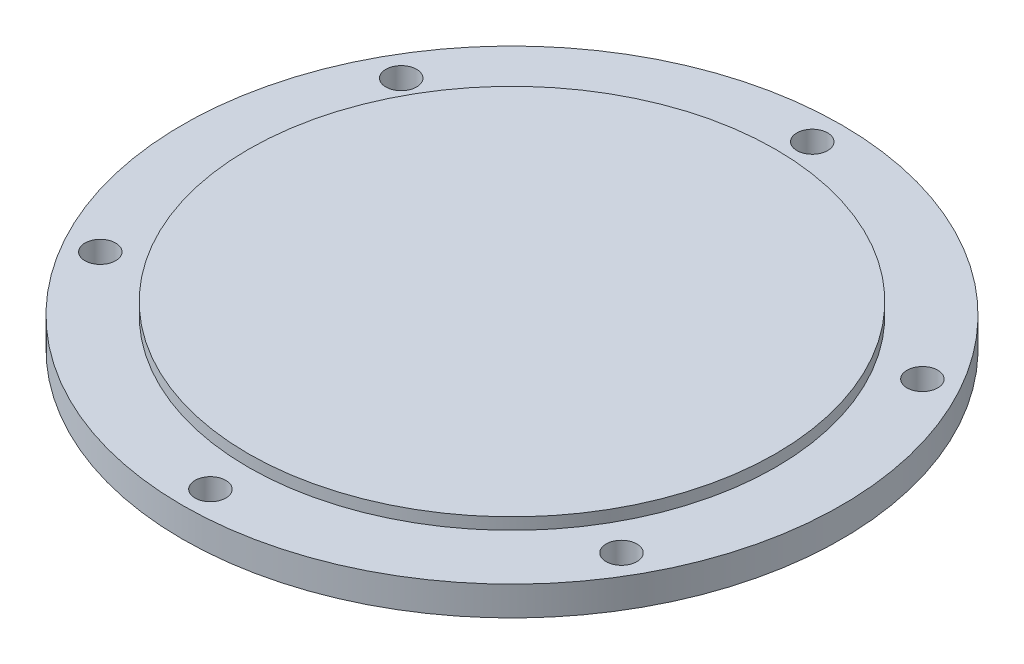
ISO-10303-21;
HEADER;
FILE_DESCRIPTION(('STEP AP214'),'2;1');
FILE_NAME('part.step','',(''),(''),'','','');
FILE_SCHEMA(('AUTOMOTIVE_DESIGN { 1 0 10303 214 1 1 1 1 }'));
ENDSEC;
DATA;
#1=APPLICATION_CONTEXT('core data for automotive mechanical design processes');
#2=APPLICATION_PROTOCOL_DEFINITION('international standard','automotive_design',2000,#1);
#3=PRODUCT_CONTEXT('',#1,'mechanical');
#4=PRODUCT('Part','Part','',(#3));
#5=PRODUCT_RELATED_PRODUCT_CATEGORY('part','',(#4));
#6=PRODUCT_DEFINITION_FORMATION('','',#4);
#7=PRODUCT_DEFINITION_CONTEXT('part definition',#1,'design');
#8=PRODUCT_DEFINITION('design','',#6,#7);
#9=PRODUCT_DEFINITION_SHAPE('','',#8);
#10=(LENGTH_UNIT() NAMED_UNIT(*) SI_UNIT(.MILLI.,.METRE.));
#11=(NAMED_UNIT(*) PLANE_ANGLE_UNIT() SI_UNIT($,.RADIAN.));
#12=(NAMED_UNIT(*) SI_UNIT($,.STERADIAN.) SOLID_ANGLE_UNIT());
#13=UNCERTAINTY_MEASURE_WITH_UNIT(LENGTH_MEASURE(1.E-05),#10,'distance_accuracy_value','');
#14=(GEOMETRIC_REPRESENTATION_CONTEXT(3) GLOBAL_UNCERTAINTY_ASSIGNED_CONTEXT((#13)) GLOBAL_UNIT_ASSIGNED_CONTEXT((#10,
#11,#12)) REPRESENTATION_CONTEXT('',''));
#15=CARTESIAN_POINT('',(0.,0.,0.));
#16=DIRECTION('',(0.,0.,1.));
#17=DIRECTION('',(1.,0.,0.));
#18=AXIS2_PLACEMENT_3D('',#15,#16,#17);
#19=CARTESIAN_POINT('',(0.,10.,0.));
#20=DIRECTION('',(0.,-1.,0.));
#21=DIRECTION('',(0.,0.,-1.));
#22=AXIS2_PLACEMENT_3D('',#19,#20,#21);
#23=CYLINDRICAL_SURFACE('',#22,112.5);
#24=CARTESIAN_POINT('',(0.,10.,0.));
#25=DIRECTION('',(0.,1.,0.));
#26=DIRECTION('',(0.,0.,1.));
#27=AXIS2_PLACEMENT_3D('',#24,#25,#26);
#28=CIRCLE('',#27,112.5);
#29=CARTESIAN_POINT('',(0.,10.,112.5));
#30=VERTEX_POINT('',#29);
#31=EDGE_CURVE('E10',#30,#30,#28,.T.);
#32=ORIENTED_EDGE('',*,*,#31,.F.);
#33=EDGE_LOOP('',(#32));
#34=FACE_BOUND('',#33,.T.);
#35=CARTESIAN_POINT('',(0.,0.,0.));
#36=DIRECTION('',(0.,1.,0.));
#37=DIRECTION('',(0.,0.,1.));
#38=AXIS2_PLACEMENT_3D('',#35,#36,#37);
#39=CIRCLE('',#38,112.5);
#40=CARTESIAN_POINT('',(0.,0.,112.5));
#41=VERTEX_POINT('',#40);
#42=EDGE_CURVE('E33',#41,#41,#39,.T.);
#43=ORIENTED_EDGE('',*,*,#42,.T.);
#44=EDGE_LOOP('',(#43));
#45=FACE_BOUND('',#44,.T.);
#46=ADVANCED_FACE('F30',(#34,#45),#23,.T.);
#47=CARTESIAN_POINT('',(0.,10.,0.));
#48=DIRECTION('',(0.,1.,0.));
#49=DIRECTION('',(0.,0.,1.));
#50=AXIS2_PLACEMENT_3D('',#47,#48,#49);
#51=PLANE('',#50);
#52=CARTESIAN_POINT('',(0.,10.,0.));
#53=DIRECTION('',(0.,1.,0.));
#54=DIRECTION('',(0.,0.,1.));
#55=AXIS2_PLACEMENT_3D('',#52,#53,#54);
#56=CIRCLE('',#55,90.);
#57=CARTESIAN_POINT('',(0.,10.,90.));
#58=VERTEX_POINT('',#57);
#59=EDGE_CURVE('E78',#58,#58,#56,.T.);
#60=ORIENTED_EDGE('',*,*,#59,.F.);
#61=EDGE_LOOP('',(#60));
#62=FACE_BOUND('',#61,.T.);
#63=CARTESIAN_POINT('',(88.9613419214222,10.,-51.1381452941973));
#64=DIRECTION('',(0.,1.,0.));
#65=DIRECTION('',(0.,0.,1.));
#66=AXIS2_PLACEMENT_3D('',#63,#64,#65);
#67=CIRCLE('',#66,5.24999999999999);
#68=CARTESIAN_POINT('',(88.9613419214222,10.,-45.8881452941973));
#69=VERTEX_POINT('',#68);
#70=EDGE_CURVE('E74',#69,#69,#67,.T.);
#71=ORIENTED_EDGE('',*,*,#70,.F.);
#72=EDGE_LOOP('',(#71));
#73=FACE_BOUND('',#72,.T.);
#74=CARTESIAN_POINT('',(88.9613419214232,10.,51.5855641174105));
#75=DIRECTION('',(0.,1.,0.));
#76=DIRECTION('',(0.,0.,1.));
#77=AXIS2_PLACEMENT_3D('',#74,#75,#76);
#78=CIRCLE('',#77,5.24999999999999);
#79=CARTESIAN_POINT('',(88.9613419214232,10.,56.8355641174105));
#80=VERTEX_POINT('',#79);
#81=EDGE_CURVE('E68',#80,#80,#78,.T.);
#82=ORIENTED_EDGE('',*,*,#81,.F.);
#83=EDGE_LOOP('',(#82));
#84=FACE_BOUND('',#83,.T.);
#85=CARTESIAN_POINT('',(0.,10.,102.947418823215));
#86=DIRECTION('',(0.,1.,0.));
#87=DIRECTION('',(0.,0.,1.));
#88=AXIS2_PLACEMENT_3D('',#85,#86,#87);
#89=CIRCLE('',#88,5.25);
#90=CARTESIAN_POINT('',(0.,10.,108.197418823215));
#91=VERTEX_POINT('',#90);
#92=EDGE_CURVE('E62',#91,#91,#89,.T.);
#93=ORIENTED_EDGE('',*,*,#92,.F.);
#94=EDGE_LOOP('',(#93));
#95=FACE_BOUND('',#94,.T.);
#96=CARTESIAN_POINT('',(-88.9613419214225,10.,51.5855641174117));
#97=DIRECTION('',(0.,1.,0.));
#98=DIRECTION('',(0.,0.,1.));
#99=AXIS2_PLACEMENT_3D('',#96,#97,#98);
#100=CIRCLE('',#99,5.24999999999999);
#101=CARTESIAN_POINT('',(-88.9613419214225,10.,56.8355641174117));
#102=VERTEX_POINT('',#101);
#103=EDGE_CURVE('E56',#102,#102,#100,.T.);
#104=ORIENTED_EDGE('',*,*,#103,.F.);
#105=EDGE_LOOP('',(#104));
#106=FACE_BOUND('',#105,.T.);
#107=CARTESIAN_POINT('',(-88.9613419214229,10.,-51.138145294196));
#108=DIRECTION('',(0.,1.,0.));
#109=DIRECTION('',(0.,0.,1.));
#110=AXIS2_PLACEMENT_3D('',#107,#108,#109);
#111=CIRCLE('',#110,5.24999999999999);
#112=CARTESIAN_POINT('',(-88.9613419214229,10.,-45.888145294196));
#113=VERTEX_POINT('',#112);
#114=EDGE_CURVE('E50',#113,#113,#111,.T.);
#115=ORIENTED_EDGE('',*,*,#114,.F.);
#116=EDGE_LOOP('',(#115));
#117=FACE_BOUND('',#116,.T.);
#118=CARTESIAN_POINT('',(0.,10.,-102.5));
#119=DIRECTION('',(0.,1.,0.));
#120=DIRECTION('',(0.,0.,1.));
#121=AXIS2_PLACEMENT_3D('',#118,#119,#120);
#122=CIRCLE('',#121,5.25);
#123=CARTESIAN_POINT('',(0.,10.,-97.25));
#124=VERTEX_POINT('',#123);
#125=EDGE_CURVE('E44',#124,#124,#122,.T.);
#126=ORIENTED_EDGE('',*,*,#125,.F.);
#127=EDGE_LOOP('',(#126));
#128=FACE_BOUND('',#127,.T.);
#129=ORIENTED_EDGE('',*,*,#31,.T.);
#130=EDGE_LOOP('',(#129));
#131=FACE_BOUND('',#130,.T.);
#132=ADVANCED_FACE('F93',(#62,#73,#84,#95,#106,#117,#128,#131),#51,.T.);
#133=CARTESIAN_POINT('',(0.,0.,0.));
#134=DIRECTION('',(0.,1.,0.));
#135=DIRECTION('',(0.,0.,1.));
#136=AXIS2_PLACEMENT_3D('',#133,#134,#135);
#137=PLANE('',#136);
#138=CARTESIAN_POINT('',(88.9613419214222,0.,-51.1381452941973));
#139=DIRECTION('',(0.,1.,0.));
#140=DIRECTION('',(0.,0.,1.));
#141=AXIS2_PLACEMENT_3D('',#138,#139,#140);
#142=CIRCLE('',#141,5.24999999999999);
#143=CARTESIAN_POINT('',(88.9613419214222,0.,-45.8881452941973));
#144=VERTEX_POINT('',#143);
#145=EDGE_CURVE('E71',#144,#144,#142,.T.);
#146=ORIENTED_EDGE('',*,*,#145,.T.);
#147=EDGE_LOOP('',(#146));
#148=FACE_BOUND('',#147,.T.);
#149=CARTESIAN_POINT('',(88.9613419214232,0.,51.5855641174105));
#150=DIRECTION('',(0.,1.,0.));
#151=DIRECTION('',(0.,0.,1.));
#152=AXIS2_PLACEMENT_3D('',#149,#150,#151);
#153=CIRCLE('',#152,5.24999999999999);
#154=CARTESIAN_POINT('',(88.9613419214232,0.,56.8355641174105));
#155=VERTEX_POINT('',#154);
#156=EDGE_CURVE('E65',#155,#155,#153,.T.);
#157=ORIENTED_EDGE('',*,*,#156,.T.);
#158=EDGE_LOOP('',(#157));
#159=FACE_BOUND('',#158,.T.);
#160=CARTESIAN_POINT('',(0.,0.,102.947418823215));
#161=DIRECTION('',(0.,1.,0.));
#162=DIRECTION('',(0.,0.,1.));
#163=AXIS2_PLACEMENT_3D('',#160,#161,#162);
#164=CIRCLE('',#163,5.24999999999999);
#165=CARTESIAN_POINT('',(0.,0.,108.197418823215));
#166=VERTEX_POINT('',#165);
#167=EDGE_CURVE('E59',#166,#166,#164,.T.);
#168=ORIENTED_EDGE('',*,*,#167,.T.);
#169=EDGE_LOOP('',(#168));
#170=FACE_BOUND('',#169,.T.);
#171=CARTESIAN_POINT('',(-88.9613419214225,0.,51.5855641174117));
#172=DIRECTION('',(0.,1.,0.));
#173=DIRECTION('',(0.,0.,1.));
#174=AXIS2_PLACEMENT_3D('',#171,#172,#173);
#175=CIRCLE('',#174,5.24999999999999);
#176=CARTESIAN_POINT('',(-88.9613419214225,0.,56.8355641174117));
#177=VERTEX_POINT('',#176);
#178=EDGE_CURVE('E53',#177,#177,#175,.T.);
#179=ORIENTED_EDGE('',*,*,#178,.T.);
#180=EDGE_LOOP('',(#179));
#181=FACE_BOUND('',#180,.T.);
#182=CARTESIAN_POINT('',(-88.9613419214229,0.,-51.138145294196));
#183=DIRECTION('',(0.,1.,0.));
#184=DIRECTION('',(0.,0.,1.));
#185=AXIS2_PLACEMENT_3D('',#182,#183,#184);
#186=CIRCLE('',#185,5.24999999999999);
#187=CARTESIAN_POINT('',(-88.9613419214229,0.,-45.888145294196));
#188=VERTEX_POINT('',#187);
#189=EDGE_CURVE('E47',#188,#188,#186,.T.);
#190=ORIENTED_EDGE('',*,*,#189,.T.);
#191=EDGE_LOOP('',(#190));
#192=FACE_BOUND('',#191,.T.);
#193=CARTESIAN_POINT('',(0.,0.,-102.5));
#194=DIRECTION('',(0.,1.,0.));
#195=DIRECTION('',(0.,0.,1.));
#196=AXIS2_PLACEMENT_3D('',#193,#194,#195);
#197=CIRCLE('',#196,5.24999999999999);
#198=CARTESIAN_POINT('',(0.,0.,-97.25));
#199=VERTEX_POINT('',#198);
#200=EDGE_CURVE('E40',#199,#199,#197,.T.);
#201=ORIENTED_EDGE('',*,*,#200,.T.);
#202=EDGE_LOOP('',(#201));
#203=FACE_BOUND('',#202,.T.);
#204=ORIENTED_EDGE('',*,*,#42,.F.);
#205=EDGE_LOOP('',(#204));
#206=FACE_BOUND('',#205,.T.);
#207=ADVANCED_FACE('F96',(#148,#159,#170,#181,#192,#203,#206),#137,.F.);
#208=CARTESIAN_POINT('',(0.,10.,-102.5));
#209=DIRECTION('',(0.,1.,0.));
#210=DIRECTION('',(0.,0.,1.));
#211=AXIS2_PLACEMENT_3D('',#208,#209,#210);
#212=CYLINDRICAL_SURFACE('',#211,5.24999999999999);
#213=ORIENTED_EDGE('',*,*,#125,.T.);
#214=EDGE_LOOP('',(#213));
#215=FACE_BOUND('',#214,.T.);
#216=ORIENTED_EDGE('',*,*,#200,.F.);
#217=EDGE_LOOP('',(#216));
#218=FACE_BOUND('',#217,.T.);
#219=ADVANCED_FACE('F110',(#215,#218),#212,.F.);
#220=CARTESIAN_POINT('',(-88.9613419214229,10.,-51.138145294196));
#221=DIRECTION('',(0.,1.,0.));
#222=DIRECTION('',(0.,0.,1.));
#223=AXIS2_PLACEMENT_3D('',#220,#221,#222);
#224=CYLINDRICAL_SURFACE('',#223,5.24999999999999);
#225=ORIENTED_EDGE('',*,*,#114,.T.);
#226=EDGE_LOOP('',(#225));
#227=FACE_BOUND('',#226,.T.);
#228=ORIENTED_EDGE('',*,*,#189,.F.);
#229=EDGE_LOOP('',(#228));
#230=FACE_BOUND('',#229,.T.);
#231=ADVANCED_FACE('F113',(#227,#230),#224,.F.);
#232=CARTESIAN_POINT('',(-88.9613419214225,10.,51.5855641174117));
#233=DIRECTION('',(0.,1.,0.));
#234=DIRECTION('',(0.,0.,1.));
#235=AXIS2_PLACEMENT_3D('',#232,#233,#234);
#236=CYLINDRICAL_SURFACE('',#235,5.24999999999999);
#237=ORIENTED_EDGE('',*,*,#103,.T.);
#238=EDGE_LOOP('',(#237));
#239=FACE_BOUND('',#238,.T.);
#240=ORIENTED_EDGE('',*,*,#178,.F.);
#241=EDGE_LOOP('',(#240));
#242=FACE_BOUND('',#241,.T.);
#243=ADVANCED_FACE('F146',(#239,#242),#236,.F.);
#244=CARTESIAN_POINT('',(0.,10.,102.947418823215));
#245=DIRECTION('',(0.,1.,0.));
#246=DIRECTION('',(0.,0.,1.));
#247=AXIS2_PLACEMENT_3D('',#244,#245,#246);
#248=CYLINDRICAL_SURFACE('',#247,5.24999999999999);
#249=ORIENTED_EDGE('',*,*,#92,.T.);
#250=EDGE_LOOP('',(#249));
#251=FACE_BOUND('',#250,.T.);
#252=ORIENTED_EDGE('',*,*,#167,.F.);
#253=EDGE_LOOP('',(#252));
#254=FACE_BOUND('',#253,.T.);
#255=ADVANCED_FACE('F154',(#251,#254),#248,.F.);
#256=CARTESIAN_POINT('',(88.9613419214232,10.,51.5855641174105));
#257=DIRECTION('',(0.,1.,0.));
#258=DIRECTION('',(0.,0.,1.));
#259=AXIS2_PLACEMENT_3D('',#256,#257,#258);
#260=CYLINDRICAL_SURFACE('',#259,5.24999999999999);
#261=ORIENTED_EDGE('',*,*,#81,.T.);
#262=EDGE_LOOP('',(#261));
#263=FACE_BOUND('',#262,.T.);
#264=ORIENTED_EDGE('',*,*,#156,.F.);
#265=EDGE_LOOP('',(#264));
#266=FACE_BOUND('',#265,.T.);
#267=ADVANCED_FACE('F162',(#263,#266),#260,.F.);
#268=CARTESIAN_POINT('',(88.9613419214222,10.,-51.1381452941973));
#269=DIRECTION('',(0.,1.,0.));
#270=DIRECTION('',(0.,0.,1.));
#271=AXIS2_PLACEMENT_3D('',#268,#269,#270);
#272=CYLINDRICAL_SURFACE('',#271,5.24999999999999);
#273=ORIENTED_EDGE('',*,*,#70,.T.);
#274=EDGE_LOOP('',(#273));
#275=FACE_BOUND('',#274,.T.);
#276=ORIENTED_EDGE('',*,*,#145,.F.);
#277=EDGE_LOOP('',(#276));
#278=FACE_BOUND('',#277,.T.);
#279=ADVANCED_FACE('F89',(#275,#278),#272,.F.);
#280=CARTESIAN_POINT('',(0.,14.,0.));
#281=DIRECTION('',(0.,-1.,0.));
#282=DIRECTION('',(0.,0.,-1.));
#283=AXIS2_PLACEMENT_3D('',#280,#281,#282);
#284=CYLINDRICAL_SURFACE('',#283,90.);
#285=CARTESIAN_POINT('',(0.,14.,0.));
#286=DIRECTION('',(0.,1.,0.));
#287=DIRECTION('',(0.,0.,1.));
#288=AXIS2_PLACEMENT_3D('',#285,#286,#287);
#289=CIRCLE('',#288,90.);
#290=CARTESIAN_POINT('',(0.,14.,90.));
#291=VERTEX_POINT('',#290);
#292=EDGE_CURVE('E77',#291,#291,#289,.T.);
#293=ORIENTED_EDGE('',*,*,#292,.F.);
#294=EDGE_LOOP('',(#293));
#295=FACE_BOUND('',#294,.T.);
#296=ORIENTED_EDGE('',*,*,#59,.T.);
#297=EDGE_LOOP('',(#296));
#298=FACE_BOUND('',#297,.T.);
#299=ADVANCED_FACE('F86',(#295,#298),#284,.T.);
#300=CARTESIAN_POINT('',(0.,14.,0.));
#301=DIRECTION('',(0.,1.,0.));
#302=DIRECTION('',(0.,0.,1.));
#303=AXIS2_PLACEMENT_3D('',#300,#301,#302);
#304=PLANE('',#303);
#305=ORIENTED_EDGE('',*,*,#292,.T.);
#306=EDGE_LOOP('',(#305));
#307=FACE_BOUND('',#306,.T.);
#308=ADVANCED_FACE('F84',(#307),#304,.T.);
#309=CLOSED_SHELL('',(#46,#132,#207,#219,#231,#243,#255,#267,#279,#299,#308));
#310=MANIFOLD_SOLID_BREP('B2',#309);
#311=ADVANCED_BREP_SHAPE_REPRESENTATION('',(#18,#310),#14);
#312=SHAPE_DEFINITION_REPRESENTATION(#9,#311);
ENDSEC;
END-ISO-10303-21;
